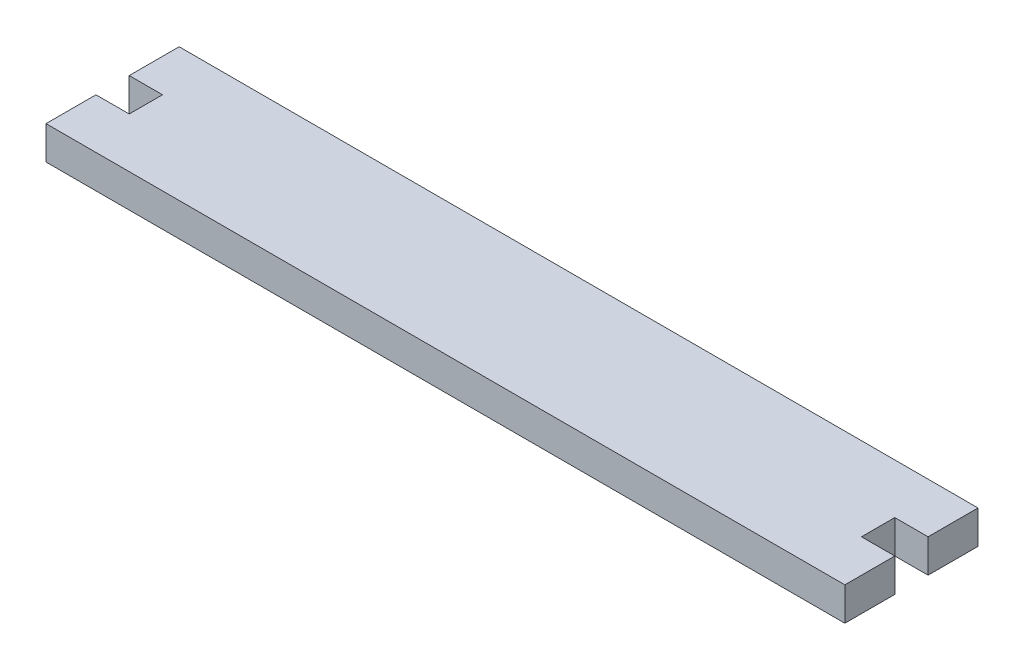
ISO-10303-21;
HEADER;
FILE_DESCRIPTION(('STEP AP214'),'2;1');
FILE_NAME('part.step','',(''),(''),'','','');
FILE_SCHEMA(('AUTOMOTIVE_DESIGN { 1 0 10303 214 1 1 1 1 }'));
ENDSEC;
DATA;
#1=APPLICATION_CONTEXT('core data for automotive mechanical design processes');
#2=APPLICATION_PROTOCOL_DEFINITION('international standard','automotive_design',2000,#1);
#3=PRODUCT_CONTEXT('',#1,'mechanical');
#4=PRODUCT('Part','Part','',(#3));
#5=PRODUCT_RELATED_PRODUCT_CATEGORY('part','',(#4));
#6=PRODUCT_DEFINITION_FORMATION('','',#4);
#7=PRODUCT_DEFINITION_CONTEXT('part definition',#1,'design');
#8=PRODUCT_DEFINITION('design','',#6,#7);
#9=PRODUCT_DEFINITION_SHAPE('','',#8);
#10=(LENGTH_UNIT() NAMED_UNIT(*) SI_UNIT(.MILLI.,.METRE.));
#11=(NAMED_UNIT(*) PLANE_ANGLE_UNIT() SI_UNIT($,.RADIAN.));
#12=(NAMED_UNIT(*) SI_UNIT($,.STERADIAN.) SOLID_ANGLE_UNIT());
#13=UNCERTAINTY_MEASURE_WITH_UNIT(LENGTH_MEASURE(1.E-05),#10,'distance_accuracy_value','');
#14=(GEOMETRIC_REPRESENTATION_CONTEXT(3) GLOBAL_UNCERTAINTY_ASSIGNED_CONTEXT((#13)) GLOBAL_UNIT_ASSIGNED_CONTEXT((#10,
#11,#12)) REPRESENTATION_CONTEXT('',''));
#15=CARTESIAN_POINT('',(0.,0.,0.));
#16=DIRECTION('',(0.,0.,1.));
#17=DIRECTION('',(1.,0.,0.));
#18=AXIS2_PLACEMENT_3D('',#15,#16,#17);
#19=CARTESIAN_POINT('',(34.925,3.175,1.5875));
#20=DIRECTION('',(0.,0.,-1.));
#21=DIRECTION('',(-1.,0.,0.));
#22=AXIS2_PLACEMENT_3D('',#19,#20,#21);
#23=PLANE('',#22);
#24=DIRECTION('',(1.,0.,0.));
#25=VECTOR('',#24,1.);
#26=CARTESIAN_POINT('',(34.925,0.,1.5875));
#27=LINE('',#26,#25);
#28=CARTESIAN_POINT('',(34.925,0.,1.5875));
#29=VERTEX_POINT('',#28);
#30=CARTESIAN_POINT('',(38.1,0.,1.5875));
#31=VERTEX_POINT('',#30);
#32=EDGE_CURVE('E153',#29,#31,#27,.T.);
#33=ORIENTED_EDGE('',*,*,#32,.F.);
#34=DIRECTION('',(0.,-1.,0.));
#35=VECTOR('',#34,1.);
#36=CARTESIAN_POINT('',(34.925,3.175,1.5875));
#37=LINE('',#36,#35);
#38=CARTESIAN_POINT('',(34.925,3.175,1.5875));
#39=VERTEX_POINT('',#38);
#40=EDGE_CURVE('E11',#39,#29,#37,.T.);
#41=ORIENTED_EDGE('',*,*,#40,.F.);
#42=DIRECTION('',(1.,0.,0.));
#43=VECTOR('',#42,1.);
#44=CARTESIAN_POINT('',(34.925,3.175,1.5875));
#45=LINE('',#44,#43);
#46=CARTESIAN_POINT('',(38.1,3.175,1.5875));
#47=VERTEX_POINT('',#46);
#48=EDGE_CURVE('E180',#39,#47,#45,.T.);
#49=ORIENTED_EDGE('',*,*,#48,.T.);
#50=DIRECTION('',(0.,-1.,0.));
#51=VECTOR('',#50,1.);
#52=CARTESIAN_POINT('',(38.1,3.175,1.5875));
#53=LINE('',#52,#51);
#54=EDGE_CURVE('E36',#47,#31,#53,.T.);
#55=ORIENTED_EDGE('',*,*,#54,.T.);
#56=EDGE_LOOP('',(#33,#41,#49,#55));
#57=FACE_BOUND('',#56,.T.);
#58=ADVANCED_FACE('F33',(#57),#23,.T.);
#59=CARTESIAN_POINT('',(34.925,3.175,-1.5875));
#60=DIRECTION('',(1.,0.,0.));
#61=DIRECTION('',(0.,0.,-1.));
#62=AXIS2_PLACEMENT_3D('',#59,#60,#61);
#63=PLANE('',#62);
#64=DIRECTION('',(0.,0.,1.));
#65=VECTOR('',#64,1.);
#66=CARTESIAN_POINT('',(34.925,0.,-1.5875));
#67=LINE('',#66,#65);
#68=CARTESIAN_POINT('',(34.925,0.,-1.5875));
#69=VERTEX_POINT('',#68);
#70=EDGE_CURVE('E178',#69,#29,#67,.T.);
#71=ORIENTED_EDGE('',*,*,#70,.F.);
#72=DIRECTION('',(0.,-1.,0.));
#73=VECTOR('',#72,1.);
#74=CARTESIAN_POINT('',(34.925,3.175,-1.5875));
#75=LINE('',#74,#73);
#76=CARTESIAN_POINT('',(34.925,3.175,-1.5875));
#77=VERTEX_POINT('',#76);
#78=EDGE_CURVE('E42',#77,#69,#75,.T.);
#79=ORIENTED_EDGE('',*,*,#78,.F.);
#80=DIRECTION('',(0.,0.,1.));
#81=VECTOR('',#80,1.);
#82=CARTESIAN_POINT('',(34.925,3.175,-1.5875));
#83=LINE('',#82,#81);
#84=EDGE_CURVE('E142',#77,#39,#83,.T.);
#85=ORIENTED_EDGE('',*,*,#84,.T.);
#86=ORIENTED_EDGE('',*,*,#40,.T.);
#87=EDGE_LOOP('',(#71,#79,#85,#86));
#88=FACE_BOUND('',#87,.T.);
#89=ADVANCED_FACE('F205',(#88),#63,.T.);
#90=CARTESIAN_POINT('',(38.1,3.175,-1.5875));
#91=DIRECTION('',(0.,0.,1.));
#92=DIRECTION('',(1.,0.,0.));
#93=AXIS2_PLACEMENT_3D('',#90,#91,#92);
#94=PLANE('',#93);
#95=DIRECTION('',(-1.,0.,0.));
#96=VECTOR('',#95,1.);
#97=CARTESIAN_POINT('',(38.1,0.,-1.5875));
#98=LINE('',#97,#96);
#99=CARTESIAN_POINT('',(38.1,0.,-1.5875));
#100=VERTEX_POINT('',#99);
#101=EDGE_CURVE('E131',#100,#69,#98,.T.);
#102=ORIENTED_EDGE('',*,*,#101,.F.);
#103=DIRECTION('',(0.,-1.,0.));
#104=VECTOR('',#103,1.);
#105=CARTESIAN_POINT('',(38.1,3.175,-1.5875));
#106=LINE('',#105,#104);
#107=CARTESIAN_POINT('',(38.1,3.175,-1.5875));
#108=VERTEX_POINT('',#107);
#109=EDGE_CURVE('E126',#108,#100,#106,.T.);
#110=ORIENTED_EDGE('',*,*,#109,.F.);
#111=DIRECTION('',(-1.,0.,0.));
#112=VECTOR('',#111,1.);
#113=CARTESIAN_POINT('',(38.1,3.175,-1.5875));
#114=LINE('',#113,#112);
#115=EDGE_CURVE('E129',#108,#77,#114,.T.);
#116=ORIENTED_EDGE('',*,*,#115,.T.);
#117=ORIENTED_EDGE('',*,*,#78,.T.);
#118=EDGE_LOOP('',(#102,#110,#116,#117));
#119=FACE_BOUND('',#118,.T.);
#120=ADVANCED_FACE('F128',(#119),#94,.T.);
#121=CARTESIAN_POINT('',(38.1,3.175,-6.35));
#122=DIRECTION('',(1.,0.,0.));
#123=DIRECTION('',(0.,0.,-1.));
#124=AXIS2_PLACEMENT_3D('',#121,#122,#123);
#125=PLANE('',#124);
#126=DIRECTION('',(0.,0.,1.));
#127=VECTOR('',#126,1.);
#128=CARTESIAN_POINT('',(38.1,0.,-6.35));
#129=LINE('',#128,#127);
#130=CARTESIAN_POINT('',(38.1,0.,-6.35));
#131=VERTEX_POINT('',#130);
#132=EDGE_CURVE('E175',#131,#100,#129,.T.);
#133=ORIENTED_EDGE('',*,*,#132,.F.);
#134=DIRECTION('',(0.,-1.,0.));
#135=VECTOR('',#134,1.);
#136=CARTESIAN_POINT('',(38.1,3.175,-6.35));
#137=LINE('',#136,#135);
#138=CARTESIAN_POINT('',(38.1,3.175,-6.35));
#139=VERTEX_POINT('',#138);
#140=EDGE_CURVE('E136',#139,#131,#137,.T.);
#141=ORIENTED_EDGE('',*,*,#140,.F.);
#142=DIRECTION('',(0.,0.,1.));
#143=VECTOR('',#142,1.);
#144=CARTESIAN_POINT('',(38.1,3.175,-6.35));
#145=LINE('',#144,#143);
#146=EDGE_CURVE('E141',#139,#108,#145,.T.);
#147=ORIENTED_EDGE('',*,*,#146,.T.);
#148=ORIENTED_EDGE('',*,*,#109,.T.);
#149=EDGE_LOOP('',(#133,#141,#147,#148));
#150=FACE_BOUND('',#149,.T.);
#151=ADVANCED_FACE('F144',(#150),#125,.T.);
#152=CARTESIAN_POINT('',(38.1,3.175,-6.35));
#153=DIRECTION('',(0.,0.,1.));
#154=DIRECTION('',(1.,0.,0.));
#155=AXIS2_PLACEMENT_3D('',#152,#153,#154);
#156=PLANE('',#155);
#157=DIRECTION('',(-1.,0.,0.));
#158=VECTOR('',#157,1.);
#159=CARTESIAN_POINT('',(38.1,0.,-6.35));
#160=LINE('',#159,#158);
#161=CARTESIAN_POINT('',(-38.1,0.,-6.34999999999999));
#162=VERTEX_POINT('',#161);
#163=EDGE_CURVE('E173',#131,#162,#160,.T.);
#164=ORIENTED_EDGE('',*,*,#163,.T.);
#165=DIRECTION('',(0.,-1.,0.));
#166=VECTOR('',#165,1.);
#167=CARTESIAN_POINT('',(-38.1,3.175,-6.34999999999999));
#168=LINE('',#167,#166);
#169=CARTESIAN_POINT('',(-38.1,3.175,-6.34999999999999));
#170=VERTEX_POINT('',#169);
#171=EDGE_CURVE('E184',#170,#162,#168,.T.);
#172=ORIENTED_EDGE('',*,*,#171,.F.);
#173=DIRECTION('',(-1.,0.,0.));
#174=VECTOR('',#173,1.);
#175=CARTESIAN_POINT('',(38.1,3.175,-6.35));
#176=LINE('',#175,#174);
#177=EDGE_CURVE('E146',#139,#170,#176,.T.);
#178=ORIENTED_EDGE('',*,*,#177,.F.);
#179=ORIENTED_EDGE('',*,*,#140,.T.);
#180=EDGE_LOOP('',(#164,#172,#178,#179));
#181=FACE_BOUND('',#180,.T.);
#182=ADVANCED_FACE('F218',(#181),#156,.F.);
#183=CARTESIAN_POINT('',(-38.1,3.175,-6.34999999999999));
#184=DIRECTION('',(1.,0.,0.));
#185=DIRECTION('',(0.,0.,-1.));
#186=AXIS2_PLACEMENT_3D('',#183,#184,#185);
#187=PLANE('',#186);
#188=DIRECTION('',(0.,0.,1.));
#189=VECTOR('',#188,1.);
#190=CARTESIAN_POINT('',(-38.1,0.,-6.34999999999999));
#191=LINE('',#190,#189);
#192=CARTESIAN_POINT('',(-38.1,0.,-1.5875));
#193=VERTEX_POINT('',#192);
#194=EDGE_CURVE('E171',#162,#193,#191,.T.);
#195=ORIENTED_EDGE('',*,*,#194,.T.);
#196=DIRECTION('',(0.,-1.,0.));
#197=VECTOR('',#196,1.);
#198=CARTESIAN_POINT('',(-38.1,3.175,-1.5875));
#199=LINE('',#198,#197);
#200=CARTESIAN_POINT('',(-38.1,3.175,-1.5875));
#201=VERTEX_POINT('',#200);
#202=EDGE_CURVE('E187',#201,#193,#199,.T.);
#203=ORIENTED_EDGE('',*,*,#202,.F.);
#204=DIRECTION('',(0.,0.,1.));
#205=VECTOR('',#204,1.);
#206=CARTESIAN_POINT('',(-38.1,3.175,-6.34999999999999));
#207=LINE('',#206,#205);
#208=EDGE_CURVE('E148',#170,#201,#207,.T.);
#209=ORIENTED_EDGE('',*,*,#208,.F.);
#210=ORIENTED_EDGE('',*,*,#171,.T.);
#211=EDGE_LOOP('',(#195,#203,#209,#210));
#212=FACE_BOUND('',#211,.T.);
#213=ADVANCED_FACE('F221',(#212),#187,.F.);
#214=CARTESIAN_POINT('',(-38.1,3.175,-1.5875));
#215=DIRECTION('',(0.,0.,-1.));
#216=DIRECTION('',(-1.,0.,0.));
#217=AXIS2_PLACEMENT_3D('',#214,#215,#216);
#218=PLANE('',#217);
#219=DIRECTION('',(1.,0.,0.));
#220=VECTOR('',#219,1.);
#221=CARTESIAN_POINT('',(-38.1,0.,-1.5875));
#222=LINE('',#221,#220);
#223=CARTESIAN_POINT('',(-34.925,0.,-1.5875));
#224=VERTEX_POINT('',#223);
#225=EDGE_CURVE('E169',#193,#224,#222,.T.);
#226=ORIENTED_EDGE('',*,*,#225,.T.);
#227=DIRECTION('',(0.,-1.,0.));
#228=VECTOR('',#227,1.);
#229=CARTESIAN_POINT('',(-34.925,3.175,-1.5875));
#230=LINE('',#229,#228);
#231=CARTESIAN_POINT('',(-34.925,3.175,-1.5875));
#232=VERTEX_POINT('',#231);
#233=EDGE_CURVE('E190',#232,#224,#230,.T.);
#234=ORIENTED_EDGE('',*,*,#233,.F.);
#235=DIRECTION('',(1.,0.,0.));
#236=VECTOR('',#235,1.);
#237=CARTESIAN_POINT('',(-38.1,3.175,-1.5875));
#238=LINE('',#237,#236);
#239=EDGE_CURVE('E350',#201,#232,#238,.T.);
#240=ORIENTED_EDGE('',*,*,#239,.F.);
#241=ORIENTED_EDGE('',*,*,#202,.T.);
#242=EDGE_LOOP('',(#226,#234,#240,#241));
#243=FACE_BOUND('',#242,.T.);
#244=ADVANCED_FACE('F225',(#243),#218,.F.);
#245=CARTESIAN_POINT('',(-34.925,3.175,-1.5875));
#246=DIRECTION('',(1.,0.,0.));
#247=DIRECTION('',(0.,0.,-1.));
#248=AXIS2_PLACEMENT_3D('',#245,#246,#247);
#249=PLANE('',#248);
#250=DIRECTION('',(0.,0.,1.));
#251=VECTOR('',#250,1.);
#252=CARTESIAN_POINT('',(-34.925,0.,-1.5875));
#253=LINE('',#252,#251);
#254=CARTESIAN_POINT('',(-34.925,0.,1.5875));
#255=VERTEX_POINT('',#254);
#256=EDGE_CURVE('E167',#224,#255,#253,.T.);
#257=ORIENTED_EDGE('',*,*,#256,.T.);
#258=DIRECTION('',(0.,-1.,0.));
#259=VECTOR('',#258,1.);
#260=CARTESIAN_POINT('',(-34.925,3.175,1.5875));
#261=LINE('',#260,#259);
#262=CARTESIAN_POINT('',(-34.925,3.175,1.5875));
#263=VERTEX_POINT('',#262);
#264=EDGE_CURVE('E193',#263,#255,#261,.T.);
#265=ORIENTED_EDGE('',*,*,#264,.F.);
#266=DIRECTION('',(0.,0.,1.));
#267=VECTOR('',#266,1.);
#268=CARTESIAN_POINT('',(-34.925,3.175,-1.5875));
#269=LINE('',#268,#267);
#270=EDGE_CURVE('E343',#232,#263,#269,.T.);
#271=ORIENTED_EDGE('',*,*,#270,.F.);
#272=ORIENTED_EDGE('',*,*,#233,.T.);
#273=EDGE_LOOP('',(#257,#265,#271,#272));
#274=FACE_BOUND('',#273,.T.);
#275=ADVANCED_FACE('F229',(#274),#249,.F.);
#276=CARTESIAN_POINT('',(-34.925,3.175,1.5875));
#277=DIRECTION('',(0.,0.,1.));
#278=DIRECTION('',(1.,0.,0.));
#279=AXIS2_PLACEMENT_3D('',#276,#277,#278);
#280=PLANE('',#279);
#281=DIRECTION('',(-1.,0.,0.));
#282=VECTOR('',#281,1.);
#283=CARTESIAN_POINT('',(-34.925,0.,1.5875));
#284=LINE('',#283,#282);
#285=CARTESIAN_POINT('',(-38.1,0.,1.5875));
#286=VERTEX_POINT('',#285);
#287=EDGE_CURVE('E165',#255,#286,#284,.T.);
#288=ORIENTED_EDGE('',*,*,#287,.T.);
#289=DIRECTION('',(0.,-1.,0.));
#290=VECTOR('',#289,1.);
#291=CARTESIAN_POINT('',(-38.1,3.175,1.5875));
#292=LINE('',#291,#290);
#293=CARTESIAN_POINT('',(-38.1,3.175,1.5875));
#294=VERTEX_POINT('',#293);
#295=EDGE_CURVE('E196',#294,#286,#292,.T.);
#296=ORIENTED_EDGE('',*,*,#295,.F.);
#297=DIRECTION('',(-1.,0.,0.));
#298=VECTOR('',#297,1.);
#299=CARTESIAN_POINT('',(-34.925,3.175,1.5875));
#300=LINE('',#299,#298);
#301=EDGE_CURVE('E340',#263,#294,#300,.T.);
#302=ORIENTED_EDGE('',*,*,#301,.F.);
#303=ORIENTED_EDGE('',*,*,#264,.T.);
#304=EDGE_LOOP('',(#288,#296,#302,#303));
#305=FACE_BOUND('',#304,.T.);
#306=ADVANCED_FACE('F233',(#305),#280,.F.);
#307=CARTESIAN_POINT('',(-38.1,3.175,1.5875));
#308=DIRECTION('',(1.,0.,0.));
#309=DIRECTION('',(0.,0.,-1.));
#310=AXIS2_PLACEMENT_3D('',#307,#308,#309);
#311=PLANE('',#310);
#312=DIRECTION('',(0.,0.,1.));
#313=VECTOR('',#312,1.);
#314=CARTESIAN_POINT('',(-38.1,0.,1.5875));
#315=LINE('',#314,#313);
#316=CARTESIAN_POINT('',(-38.1,0.,6.35));
#317=VERTEX_POINT('',#316);
#318=EDGE_CURVE('E162',#286,#317,#315,.T.);
#319=ORIENTED_EDGE('',*,*,#318,.T.);
#320=DIRECTION('',(0.,-1.,0.));
#321=VECTOR('',#320,1.);
#322=CARTESIAN_POINT('',(-38.1,3.175,6.35));
#323=LINE('',#322,#321);
#324=CARTESIAN_POINT('',(-38.1,3.175,6.35));
#325=VERTEX_POINT('',#324);
#326=EDGE_CURVE('E199',#325,#317,#323,.T.);
#327=ORIENTED_EDGE('',*,*,#326,.F.);
#328=DIRECTION('',(0.,0.,1.));
#329=VECTOR('',#328,1.);
#330=CARTESIAN_POINT('',(-38.1,3.175,1.5875));
#331=LINE('',#330,#329);
#332=EDGE_CURVE('E338',#294,#325,#331,.T.);
#333=ORIENTED_EDGE('',*,*,#332,.F.);
#334=ORIENTED_EDGE('',*,*,#295,.T.);
#335=EDGE_LOOP('',(#319,#327,#333,#334));
#336=FACE_BOUND('',#335,.T.);
#337=ADVANCED_FACE('F237',(#336),#311,.F.);
#338=CARTESIAN_POINT('',(38.1,3.175,6.35));
#339=DIRECTION('',(0.,0.,1.));
#340=DIRECTION('',(1.,0.,0.));
#341=AXIS2_PLACEMENT_3D('',#338,#339,#340);
#342=PLANE('',#341);
#343=DIRECTION('',(-1.,0.,0.));
#344=VECTOR('',#343,1.);
#345=CARTESIAN_POINT('',(38.1,0.,6.35));
#346=LINE('',#345,#344);
#347=CARTESIAN_POINT('',(38.1,0.,6.35));
#348=VERTEX_POINT('',#347);
#349=EDGE_CURVE('E159',#348,#317,#346,.T.);
#350=ORIENTED_EDGE('',*,*,#349,.F.);
#351=DIRECTION('',(0.,-1.,0.));
#352=VECTOR('',#351,1.);
#353=CARTESIAN_POINT('',(38.1,3.175,6.35));
#354=LINE('',#353,#352);
#355=CARTESIAN_POINT('',(38.1,3.175,6.35));
#356=VERTEX_POINT('',#355);
#357=EDGE_CURVE('E200',#356,#348,#354,.T.);
#358=ORIENTED_EDGE('',*,*,#357,.F.);
#359=DIRECTION('',(-1.,0.,0.));
#360=VECTOR('',#359,1.);
#361=CARTESIAN_POINT('',(38.1,3.175,6.35));
#362=LINE('',#361,#360);
#363=EDGE_CURVE('E358',#356,#325,#362,.T.);
#364=ORIENTED_EDGE('',*,*,#363,.T.);
#365=ORIENTED_EDGE('',*,*,#326,.T.);
#366=EDGE_LOOP('',(#350,#358,#364,#365));
#367=FACE_BOUND('',#366,.T.);
#368=ADVANCED_FACE('F241',(#367),#342,.T.);
#369=CARTESIAN_POINT('',(38.1,3.175,1.5875));
#370=DIRECTION('',(1.,0.,0.));
#371=DIRECTION('',(0.,0.,-1.));
#372=AXIS2_PLACEMENT_3D('',#369,#370,#371);
#373=PLANE('',#372);
#374=DIRECTION('',(0.,0.,1.));
#375=VECTOR('',#374,1.);
#376=CARTESIAN_POINT('',(38.1,0.,1.5875));
#377=LINE('',#376,#375);
#378=EDGE_CURVE('E156',#31,#348,#377,.T.);
#379=ORIENTED_EDGE('',*,*,#378,.F.);
#380=ORIENTED_EDGE('',*,*,#54,.F.);
#381=DIRECTION('',(0.,0.,1.));
#382=VECTOR('',#381,1.);
#383=CARTESIAN_POINT('',(38.1,3.175,1.5875));
#384=LINE('',#383,#382);
#385=EDGE_CURVE('E360',#47,#356,#384,.T.);
#386=ORIENTED_EDGE('',*,*,#385,.T.);
#387=ORIENTED_EDGE('',*,*,#357,.T.);
#388=EDGE_LOOP('',(#379,#380,#386,#387));
#389=FACE_BOUND('',#388,.T.);
#390=ADVANCED_FACE('F202',(#389),#373,.T.);
#391=CARTESIAN_POINT('',(0.,3.175,0.));
#392=DIRECTION('',(0.,-1.,0.));
#393=DIRECTION('',(0.,0.,-1.));
#394=AXIS2_PLACEMENT_3D('',#391,#392,#393);
#395=PLANE('',#394);
#396=ORIENTED_EDGE('',*,*,#48,.F.);
#397=ORIENTED_EDGE('',*,*,#84,.F.);
#398=ORIENTED_EDGE('',*,*,#115,.F.);
#399=ORIENTED_EDGE('',*,*,#146,.F.);
#400=ORIENTED_EDGE('',*,*,#177,.T.);
#401=ORIENTED_EDGE('',*,*,#208,.T.);
#402=ORIENTED_EDGE('',*,*,#239,.T.);
#403=ORIENTED_EDGE('',*,*,#270,.T.);
#404=ORIENTED_EDGE('',*,*,#301,.T.);
#405=ORIENTED_EDGE('',*,*,#332,.T.);
#406=ORIENTED_EDGE('',*,*,#363,.F.);
#407=ORIENTED_EDGE('',*,*,#385,.F.);
#408=EDGE_LOOP('',(#396,#397,#398,#399,#400,#401,#402,#403,#404,#405,#406,#407));
#409=FACE_BOUND('',#408,.T.);
#410=ADVANCED_FACE('F140',(#409),#395,.F.);
#411=CARTESIAN_POINT('',(0.,0.,0.));
#412=DIRECTION('',(0.,-1.,0.));
#413=DIRECTION('',(0.,0.,-1.));
#414=AXIS2_PLACEMENT_3D('',#411,#412,#413);
#415=PLANE('',#414);
#416=ORIENTED_EDGE('',*,*,#32,.T.);
#417=ORIENTED_EDGE('',*,*,#378,.T.);
#418=ORIENTED_EDGE('',*,*,#349,.T.);
#419=ORIENTED_EDGE('',*,*,#318,.F.);
#420=ORIENTED_EDGE('',*,*,#287,.F.);
#421=ORIENTED_EDGE('',*,*,#256,.F.);
#422=ORIENTED_EDGE('',*,*,#225,.F.);
#423=ORIENTED_EDGE('',*,*,#194,.F.);
#424=ORIENTED_EDGE('',*,*,#163,.F.);
#425=ORIENTED_EDGE('',*,*,#132,.T.);
#426=ORIENTED_EDGE('',*,*,#101,.T.);
#427=ORIENTED_EDGE('',*,*,#70,.T.);
#428=EDGE_LOOP('',(#416,#417,#418,#419,#420,#421,#422,#423,#424,#425,#426,#427));
#429=FACE_BOUND('',#428,.T.);
#430=ADVANCED_FACE('F204',(#429),#415,.T.);
#431=CLOSED_SHELL('',(#58,#89,#120,#151,#182,#213,#244,#275,#306,#337,#368,#390,#410,#430));
#432=MANIFOLD_SOLID_BREP('B2',#431);
#433=ADVANCED_BREP_SHAPE_REPRESENTATION('',(#18,#432),#14);
#434=SHAPE_DEFINITION_REPRESENTATION(#9,#433);
ENDSEC;
END-ISO-10303-21;
